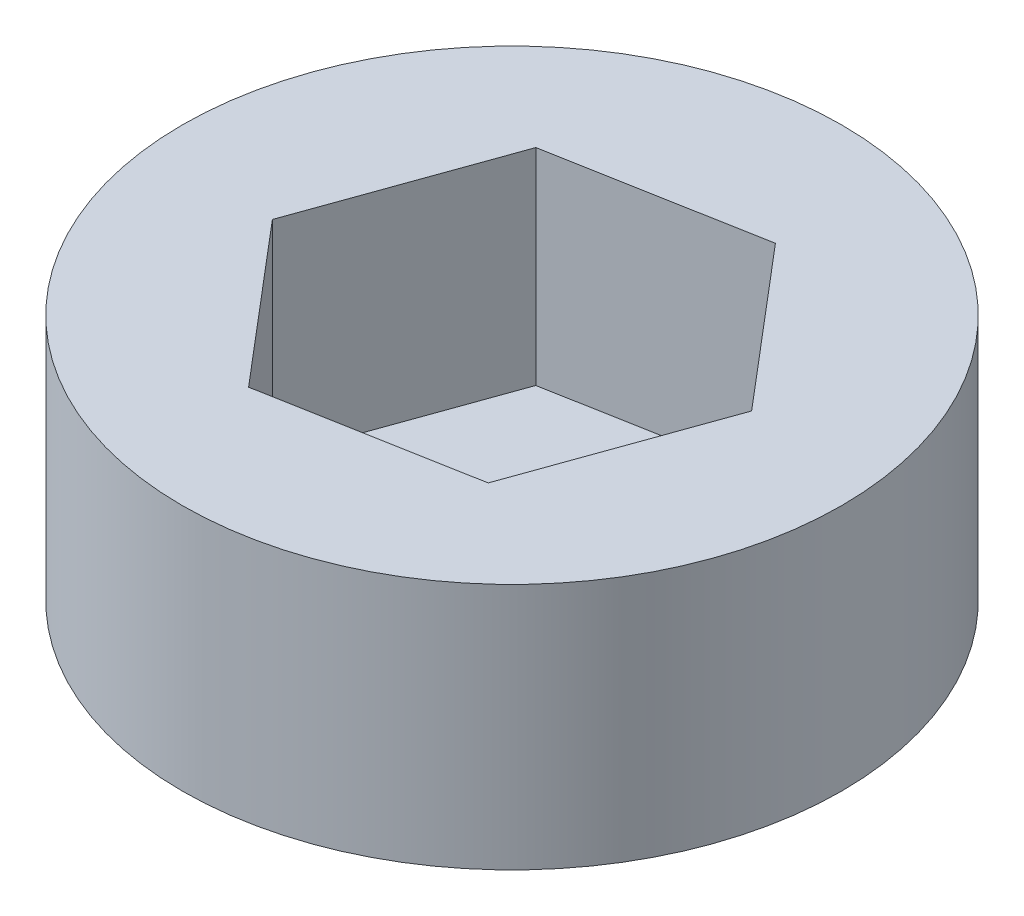
ISO-10303-21;
HEADER;
FILE_DESCRIPTION(('STEP AP214'),'2;1');
FILE_NAME('part.step','',(''),(''),'','','');
FILE_SCHEMA(('AUTOMOTIVE_DESIGN { 1 0 10303 214 1 1 1 1 }'));
ENDSEC;
DATA;
#1=APPLICATION_CONTEXT('core data for automotive mechanical design processes');
#2=APPLICATION_PROTOCOL_DEFINITION('international standard','automotive_design',2000,#1);
#3=PRODUCT_CONTEXT('',#1,'mechanical');
#4=PRODUCT('Part','Part','',(#3));
#5=PRODUCT_RELATED_PRODUCT_CATEGORY('part','',(#4));
#6=PRODUCT_DEFINITION_FORMATION('','',#4);
#7=PRODUCT_DEFINITION_CONTEXT('part definition',#1,'design');
#8=PRODUCT_DEFINITION('design','',#6,#7);
#9=PRODUCT_DEFINITION_SHAPE('','',#8);
#10=(LENGTH_UNIT() NAMED_UNIT(*) SI_UNIT(.MILLI.,.METRE.));
#11=(NAMED_UNIT(*) PLANE_ANGLE_UNIT() SI_UNIT($,.RADIAN.));
#12=(NAMED_UNIT(*) SI_UNIT($,.STERADIAN.) SOLID_ANGLE_UNIT());
#13=UNCERTAINTY_MEASURE_WITH_UNIT(LENGTH_MEASURE(1.E-05),#10,'distance_accuracy_value','');
#14=(GEOMETRIC_REPRESENTATION_CONTEXT(3) GLOBAL_UNCERTAINTY_ASSIGNED_CONTEXT((#13)) GLOBAL_UNIT_ASSIGNED_CONTEXT((#10,
#11,#12)) REPRESENTATION_CONTEXT('',''));
#15=CARTESIAN_POINT('',(0.,0.,0.));
#16=DIRECTION('',(0.,0.,1.));
#17=DIRECTION('',(1.,0.,0.));
#18=AXIS2_PLACEMENT_3D('',#15,#16,#17);
#19=CARTESIAN_POINT('',(0.,0.,0.));
#20=DIRECTION('',(0.,1.,0.));
#21=DIRECTION('',(0.,0.,1.));
#22=AXIS2_PLACEMENT_3D('',#19,#20,#21);
#23=CYLINDRICAL_SURFACE('',#22,1.5875);
#24=CARTESIAN_POINT('',(0.,0.,0.));
#25=DIRECTION('',(0.,1.,0.));
#26=DIRECTION('',(0.,0.,1.));
#27=AXIS2_PLACEMENT_3D('',#24,#25,#26);
#28=CIRCLE('',#27,1.5875);
#29=CARTESIAN_POINT('',(0.,0.,1.5875));
#30=VERTEX_POINT('',#29);
#31=EDGE_CURVE('E145',#30,#30,#28,.T.);
#32=CARTESIAN_POINT('',(0.,1.27,0.));
#33=DIRECTION('',(0.,1.,0.));
#34=DIRECTION('',(0.,0.,1.));
#35=AXIS2_PLACEMENT_3D('',#32,#33,#34);
#36=CIRCLE('',#35,1.5875);
#37=CARTESIAN_POINT('',(0.,1.27,1.5875));
#38=VERTEX_POINT('',#37);
#39=EDGE_CURVE('E39',#38,#38,#36,.F.);
#40=CARTESIAN_POINT('',(0.,0.,1.5875));
#41=CARTESIAN_POINT('',(0.,0.0132291666666667,1.5875));
#42=CARTESIAN_POINT('',(0.,0.0264583333333333,1.5875));
#43=CARTESIAN_POINT('',(0.,0.0529166666666666,1.5875));
#44=CARTESIAN_POINT('',(0.,0.0661458333333333,1.5875));
#45=CARTESIAN_POINT('',(0.,0.0926041666666666,1.5875));
#46=CARTESIAN_POINT('',(0.,0.105833333333333,1.5875));
#47=CARTESIAN_POINT('',(0.,0.132291666666667,1.5875));
#48=CARTESIAN_POINT('',(0.,0.145520833333333,1.5875));
#49=CARTESIAN_POINT('',(0.,0.171979166666667,1.5875));
#50=CARTESIAN_POINT('',(0.,0.185208333333333,1.5875));
#51=CARTESIAN_POINT('',(0.,0.211666666666667,1.5875));
#52=CARTESIAN_POINT('',(0.,0.224895833333333,1.5875));
#53=CARTESIAN_POINT('',(0.,0.251354166666666,1.5875));
#54=CARTESIAN_POINT('',(0.,0.264583333333333,1.5875));
#55=CARTESIAN_POINT('',(0.,0.291041666666666,1.5875));
#56=CARTESIAN_POINT('',(0.,0.304270833333333,1.5875));
#57=CARTESIAN_POINT('',(0.,0.330729166666666,1.5875));
#58=CARTESIAN_POINT('',(0.,0.343958333333333,1.5875));
#59=CARTESIAN_POINT('',(0.,0.370416666666666,1.5875));
#60=CARTESIAN_POINT('',(0.,0.383645833333333,1.5875));
#61=CARTESIAN_POINT('',(0.,0.410104166666666,1.5875));
#62=CARTESIAN_POINT('',(0.,0.423333333333333,1.5875));
#63=CARTESIAN_POINT('',(0.,0.449791666666666,1.5875));
#64=CARTESIAN_POINT('',(0.,0.463020833333333,1.5875));
#65=CARTESIAN_POINT('',(0.,0.489479166666666,1.5875));
#66=CARTESIAN_POINT('',(0.,0.502708333333333,1.5875));
#67=CARTESIAN_POINT('',(0.,0.529166666666666,1.5875));
#68=CARTESIAN_POINT('',(0.,0.542395833333333,1.5875));
#69=CARTESIAN_POINT('',(0.,0.568854166666666,1.5875));
#70=CARTESIAN_POINT('',(0.,0.582083333333333,1.5875));
#71=CARTESIAN_POINT('',(0.,0.608541666666666,1.5875));
#72=CARTESIAN_POINT('',(0.,0.621770833333333,1.5875));
#73=CARTESIAN_POINT('',(0.,0.648229166666666,1.5875));
#74=CARTESIAN_POINT('',(0.,0.661458333333333,1.5875));
#75=CARTESIAN_POINT('',(0.,0.687916666666666,1.5875));
#76=CARTESIAN_POINT('',(0.,0.701145833333333,1.5875));
#77=CARTESIAN_POINT('',(0.,0.727604166666666,1.5875));
#78=CARTESIAN_POINT('',(0.,0.740833333333333,1.5875));
#79=CARTESIAN_POINT('',(0.,0.767291666666666,1.5875));
#80=CARTESIAN_POINT('',(0.,0.780520833333333,1.5875));
#81=CARTESIAN_POINT('',(0.,0.806979166666666,1.5875));
#82=CARTESIAN_POINT('',(0.,0.820208333333333,1.5875));
#83=CARTESIAN_POINT('',(0.,0.846666666666666,1.5875));
#84=CARTESIAN_POINT('',(0.,0.859895833333333,1.5875));
#85=CARTESIAN_POINT('',(0.,0.886354166666666,1.5875));
#86=CARTESIAN_POINT('',(0.,0.899583333333333,1.5875));
#87=CARTESIAN_POINT('',(0.,0.926041666666666,1.5875));
#88=CARTESIAN_POINT('',(0.,0.939270833333333,1.5875));
#89=CARTESIAN_POINT('',(0.,0.965729166666666,1.5875));
#90=CARTESIAN_POINT('',(0.,0.978958333333333,1.5875));
#91=CARTESIAN_POINT('',(0.,1.00541666666667,1.5875));
#92=CARTESIAN_POINT('',(0.,1.01864583333333,1.5875));
#93=CARTESIAN_POINT('',(0.,1.04510416666667,1.5875));
#94=CARTESIAN_POINT('',(0.,1.05833333333333,1.5875));
#95=CARTESIAN_POINT('',(0.,1.08479166666667,1.5875));
#96=CARTESIAN_POINT('',(0.,1.09802083333333,1.5875));
#97=CARTESIAN_POINT('',(0.,1.12447916666667,1.5875));
#98=CARTESIAN_POINT('',(0.,1.13770833333333,1.5875));
#99=CARTESIAN_POINT('',(0.,1.16416666666667,1.5875));
#100=CARTESIAN_POINT('',(0.,1.17739583333333,1.5875));
#101=CARTESIAN_POINT('',(0.,1.20385416666667,1.5875));
#102=CARTESIAN_POINT('',(0.,1.21708333333333,1.5875));
#103=CARTESIAN_POINT('',(0.,1.24354166666667,1.5875));
#104=CARTESIAN_POINT('',(0.,1.25677083333333,1.5875));
#105=CARTESIAN_POINT('',(0.,1.27,1.5875));
#106=B_SPLINE_CURVE_WITH_KNOTS('',3,(#40,#41,#42,#43,#44,#45,#46,#47,#48,#49,#50,#51,#52,#53,
#54,#55,#56,#57,#58,#59,#60,#61,#62,#63,#64,#65,#66,#67,#68,#69,#70,#71,#72,#73,#74,#75,#76,#77,
#78,#79,#80,#81,#82,#83,#84,#85,#86,#87,#88,#89,#90,#91,#92,#93,#94,#95,#96,#97,#98,#99,#100,
#101,#102,#103,#104,#105),.UNSPECIFIED.,.F.,.F.,(4,2,2,2,2,2,2,2,2,2,2,2,2,2,2,2,2,2,2,2,2,2,2,
2,2,2,2,2,2,2,2,2,4),(0.,0.0396875,0.0793749999999999,0.1190625,0.15875,0.1984375,0.238125,
0.2778125,0.3175,0.3571875,0.396875,0.4365625,0.47625,0.5159375,0.555625,0.5953125,0.635,
0.6746875,0.714375,0.7540625,0.79375,0.833437499999999,0.873124999999999,0.912812499999999,
0.952499999999999,0.992187499999999,1.031875,1.0715625,1.11125,1.1509375,1.190625,1.2303125,
1.27),.UNSPECIFIED.);
#107=EDGE_CURVE('BSEAM35',#30,#38,#106,.T.);
#108=ORIENTED_EDGE('',*,*,#31,.F.);
#109=ORIENTED_EDGE('',*,*,#39,.F.);
#110=ORIENTED_EDGE('',*,*,#107,.T.);
#111=ORIENTED_EDGE('',*,*,#107,.F.);
#112=EDGE_LOOP('',(#108,#110,#109,#111));
#113=FACE_BOUND('',#112,.T.);
#114=ADVANCED_FACE('F35',(#113),#23,.F.);
#115=CARTESIAN_POINT('',(0.,7.62,0.));
#116=DIRECTION('',(0.,-1.,0.));
#117=DIRECTION('',(0.,0.,-1.));
#118=AXIS2_PLACEMENT_3D('',#115,#116,#117);
#119=CYLINDRICAL_SURFACE('',#118,10.16);
#120=CARTESIAN_POINT('',(0.,7.62,0.));
#121=DIRECTION('',(0.,1.,0.));
#122=DIRECTION('',(0.,0.,1.));
#123=AXIS2_PLACEMENT_3D('',#120,#121,#122);
#124=CIRCLE('',#123,10.16);
#125=CARTESIAN_POINT('',(0.,7.62,-10.16));
#126=VERTEX_POINT('',#125);
#127=EDGE_CURVE('E11',#126,#126,#124,.T.);
#128=CARTESIAN_POINT('',(0.,0.,0.));
#129=DIRECTION('',(0.,1.,0.));
#130=DIRECTION('',(0.,0.,1.));
#131=AXIS2_PLACEMENT_3D('',#128,#129,#130);
#132=CIRCLE('',#131,10.16);
#133=CARTESIAN_POINT('',(0.,0.,-10.16));
#134=VERTEX_POINT('',#133);
#135=EDGE_CURVE('E44',#134,#134,#132,.T.);
#136=CARTESIAN_POINT('',(0.,7.62,-10.16));
#137=CARTESIAN_POINT('',(0.,7.540625,-10.16));
#138=CARTESIAN_POINT('',(0.,7.46125,-10.16));
#139=CARTESIAN_POINT('',(0.,7.3025,-10.16));
#140=CARTESIAN_POINT('',(0.,7.223125,-10.16));
#141=CARTESIAN_POINT('',(0.,7.064375,-10.16));
#142=CARTESIAN_POINT('',(0.,6.985,-10.16));
#143=CARTESIAN_POINT('',(0.,6.82625,-10.16));
#144=CARTESIAN_POINT('',(0.,6.746875,-10.16));
#145=CARTESIAN_POINT('',(0.,6.588125,-10.16));
#146=CARTESIAN_POINT('',(0.,6.50875,-10.16));
#147=CARTESIAN_POINT('',(0.,6.35,-10.16));
#148=CARTESIAN_POINT('',(0.,6.270625,-10.16));
#149=CARTESIAN_POINT('',(0.,6.111875,-10.16));
#150=CARTESIAN_POINT('',(0.,6.0325,-10.16));
#151=CARTESIAN_POINT('',(0.,5.87375,-10.16));
#152=CARTESIAN_POINT('',(0.,5.794375,-10.16));
#153=CARTESIAN_POINT('',(0.,5.635625,-10.16));
#154=CARTESIAN_POINT('',(0.,5.55625,-10.16));
#155=CARTESIAN_POINT('',(0.,5.3975,-10.16));
#156=CARTESIAN_POINT('',(0.,5.318125,-10.16));
#157=CARTESIAN_POINT('',(0.,5.159375,-10.16));
#158=CARTESIAN_POINT('',(0.,5.08,-10.16));
#159=CARTESIAN_POINT('',(0.,4.92125,-10.16));
#160=CARTESIAN_POINT('',(0.,4.841875,-10.16));
#161=CARTESIAN_POINT('',(0.,4.683125,-10.16));
#162=CARTESIAN_POINT('',(0.,4.60375,-10.16));
#163=CARTESIAN_POINT('',(0.,4.445,-10.16));
#164=CARTESIAN_POINT('',(0.,4.365625,-10.16));
#165=CARTESIAN_POINT('',(0.,4.206875,-10.16));
#166=CARTESIAN_POINT('',(0.,4.1275,-10.16));
#167=CARTESIAN_POINT('',(0.,3.96875,-10.16));
#168=CARTESIAN_POINT('',(0.,3.889375,-10.16));
#169=CARTESIAN_POINT('',(0.,3.730625,-10.16));
#170=CARTESIAN_POINT('',(0.,3.65125,-10.16));
#171=CARTESIAN_POINT('',(0.,3.4925,-10.16));
#172=CARTESIAN_POINT('',(0.,3.413125,-10.16));
#173=CARTESIAN_POINT('',(0.,3.254375,-10.16));
#174=CARTESIAN_POINT('',(0.,3.175,-10.16));
#175=CARTESIAN_POINT('',(0.,3.01625,-10.16));
#176=CARTESIAN_POINT('',(0.,2.936875,-10.16));
#177=CARTESIAN_POINT('',(0.,2.778125,-10.16));
#178=CARTESIAN_POINT('',(0.,2.69875,-10.16));
#179=CARTESIAN_POINT('',(0.,2.54,-10.16));
#180=CARTESIAN_POINT('',(0.,2.460625,-10.16));
#181=CARTESIAN_POINT('',(0.,2.301875,-10.16));
#182=CARTESIAN_POINT('',(0.,2.2225,-10.16));
#183=CARTESIAN_POINT('',(0.,2.06375,-10.16));
#184=CARTESIAN_POINT('',(0.,1.984375,-10.16));
#185=CARTESIAN_POINT('',(0.,1.825625,-10.16));
#186=CARTESIAN_POINT('',(0.,1.74625,-10.16));
#187=CARTESIAN_POINT('',(0.,1.5875,-10.16));
#188=CARTESIAN_POINT('',(0.,1.508125,-10.16));
#189=CARTESIAN_POINT('',(0.,1.349375,-10.16));
#190=CARTESIAN_POINT('',(0.,1.27,-10.16));
#191=CARTESIAN_POINT('',(0.,1.11125,-10.16));
#192=CARTESIAN_POINT('',(0.,1.031875,-10.16));
#193=CARTESIAN_POINT('',(0.,0.873125,-10.16));
#194=CARTESIAN_POINT('',(0.,0.79375,-10.16));
#195=CARTESIAN_POINT('',(0.,0.635,-10.16));
#196=CARTESIAN_POINT('',(0.,0.555625,-10.16));
#197=CARTESIAN_POINT('',(0.,0.396875,-10.16));
#198=CARTESIAN_POINT('',(0.,0.3175,-10.16));
#199=CARTESIAN_POINT('',(0.,0.15875,-10.16));
#200=CARTESIAN_POINT('',(0.,0.0793749999999999,-10.16));
#201=CARTESIAN_POINT('',(0.,0.,-10.16));
#202=B_SPLINE_CURVE_WITH_KNOTS('',3,(#136,#137,#138,#139,#140,#141,#142,#143,#144,#145,#146,
#147,#148,#149,#150,#151,#152,#153,#154,#155,#156,#157,#158,#159,#160,#161,#162,#163,#164,#165,
#166,#167,#168,#169,#170,#171,#172,#173,#174,#175,#176,#177,#178,#179,#180,#181,#182,#183,#184,
#185,#186,#187,#188,#189,#190,#191,#192,#193,#194,#195,#196,#197,#198,#199,#200,#201),
.UNSPECIFIED.,.F.,.F.,(4,2,2,2,2,2,2,2,2,2,2,2,2,2,2,2,2,2,2,2,2,2,2,2,2,2,2,2,2,2,2,2,4),(0.,
0.238125,0.47625,0.714375000000001,0.9525,1.190625,1.42875,1.666875,1.905,2.143125,2.38125,
2.619375,2.8575,3.095625,3.33375,3.571875,3.81,4.048125,4.28625,4.524375,4.7625,5.000625,
5.23875,5.476875,5.715,5.953125,6.19125,6.429375,6.6675,6.905625,7.14375,7.381875,7.62),.UNSPECIFIED.);
#203=EDGE_CURVE('BSEAM37',#126,#134,#202,.T.);
#204=ORIENTED_EDGE('',*,*,#127,.F.);
#205=ORIENTED_EDGE('',*,*,#135,.T.);
#206=ORIENTED_EDGE('',*,*,#203,.T.);
#207=ORIENTED_EDGE('',*,*,#203,.F.);
#208=EDGE_LOOP('',(#204,#206,#205,#207));
#209=FACE_BOUND('',#208,.T.);
#210=ADVANCED_FACE('F37',(#209),#119,.T.);
#211=CARTESIAN_POINT('',(0.,7.62,0.));
#212=DIRECTION('',(0.,1.,0.));
#213=DIRECTION('',(0.,0.,1.));
#214=AXIS2_PLACEMENT_3D('',#211,#212,#213);
#215=PLANE('',#214);
#216=DIRECTION('',(0.336838208201734,0.,-0.94156254252994));
#217=VECTOR('',#216,1.);
#218=CARTESIAN_POINT('',(4.10843715383524,7.62,4.84182239998394));
#219=LINE('',#218,#217);
#220=CARTESIAN_POINT('',(4.10843715383524,7.62,4.84182239998394));
#221=VERTEX_POINT('',#220);
#222=CARTESIAN_POINT('',(6.24735977591625,7.62,-1.13709974508118));
#223=VERTEX_POINT('',#222);
#224=EDGE_CURVE('E52',#221,#223,#219,.T.);
#225=ORIENTED_EDGE('',*,*,#224,.F.);
#226=DIRECTION('',(0.983836185183661,0.,-0.179070825997037));
#227=VECTOR('',#226,1.);
#228=CARTESIAN_POINT('',(-2.13892262208101,7.62,5.97892214506512));
#229=LINE('',#228,#227);
#230=CARTESIAN_POINT('',(-2.13892262208101,7.62,5.97892214506512));
#231=VERTEX_POINT('',#230);
#232=EDGE_CURVE('E136',#231,#221,#229,.T.);
#233=ORIENTED_EDGE('',*,*,#232,.F.);
#234=DIRECTION('',(0.646997976981927,0.,0.762491716532903));
#235=VECTOR('',#234,1.);
#236=CARTESIAN_POINT('',(-6.24735977591625,7.62,1.13709974508118));
#237=LINE('',#236,#235);
#238=CARTESIAN_POINT('',(-6.24735977591625,7.62,1.13709974508118));
#239=VERTEX_POINT('',#238);
#240=EDGE_CURVE('E134',#239,#231,#237,.T.);
#241=ORIENTED_EDGE('',*,*,#240,.F.);
#242=DIRECTION('',(-0.336838208201733,0.,0.94156254252994));
#243=VECTOR('',#242,1.);
#244=CARTESIAN_POINT('',(-4.10843715383524,7.62,-4.84182239998394));
#245=LINE('',#244,#243);
#246=CARTESIAN_POINT('',(-4.10843715383524,7.62,-4.84182239998394));
#247=VERTEX_POINT('',#246);
#248=EDGE_CURVE('E100',#247,#239,#245,.T.);
#249=ORIENTED_EDGE('',*,*,#248,.F.);
#250=DIRECTION('',(-0.983836185183661,0.,0.179070825997037));
#251=VECTOR('',#250,1.);
#252=CARTESIAN_POINT('',(2.13892262208101,7.62,-5.97892214506512));
#253=LINE('',#252,#251);
#254=CARTESIAN_POINT('',(2.13892262208101,7.62,-5.97892214506512));
#255=VERTEX_POINT('',#254);
#256=EDGE_CURVE('E130',#255,#247,#253,.T.);
#257=ORIENTED_EDGE('',*,*,#256,.F.);
#258=DIRECTION('',(-0.646997976981928,0.,-0.762491716532903));
#259=VECTOR('',#258,1.);
#260=CARTESIAN_POINT('',(6.24735977591625,7.62,-1.13709974508118));
#261=LINE('',#260,#259);
#262=EDGE_CURVE('E127',#223,#255,#261,.T.);
#263=ORIENTED_EDGE('',*,*,#262,.F.);
#264=EDGE_LOOP('',(#225,#233,#241,#249,#257,#263));
#265=FACE_BOUND('',#264,.T.);
#266=ORIENTED_EDGE('',*,*,#127,.T.);
#267=EDGE_LOOP('',(#266));
#268=FACE_BOUND('',#267,.T.);
#269=ADVANCED_FACE('F153',(#265,#268),#215,.T.);
#270=CARTESIAN_POINT('',(0.,0.,0.));
#271=DIRECTION('',(0.,1.,0.));
#272=DIRECTION('',(0.,0.,1.));
#273=AXIS2_PLACEMENT_3D('',#270,#271,#272);
#274=PLANE('',#273);
#275=ORIENTED_EDGE('',*,*,#31,.T.);
#276=EDGE_LOOP('',(#275));
#277=FACE_BOUND('',#276,.T.);
#278=ORIENTED_EDGE('',*,*,#135,.F.);
#279=EDGE_LOOP('',(#278));
#280=FACE_BOUND('',#279,.T.);
#281=ADVANCED_FACE('F151',(#277,#280),#274,.F.);
#282=CARTESIAN_POINT('',(0.,1.27,0.));
#283=DIRECTION('',(0.,1.,0.));
#284=DIRECTION('',(0.,0.,1.));
#285=AXIS2_PLACEMENT_3D('',#282,#283,#284);
#286=PLANE('',#285);
#287=DIRECTION('',(0.336838208201734,0.,-0.94156254252994));
#288=VECTOR('',#287,1.);
#289=CARTESIAN_POINT('',(4.10843715383524,1.27,4.84182239998394));
#290=LINE('',#289,#288);
#291=CARTESIAN_POINT('',(4.10843715383524,1.27,4.84182239998394));
#292=VERTEX_POINT('',#291);
#293=CARTESIAN_POINT('',(6.24735977591625,1.27,-1.13709974508118));
#294=VERTEX_POINT('',#293);
#295=EDGE_CURVE('E138',#292,#294,#290,.T.);
#296=ORIENTED_EDGE('',*,*,#295,.T.);
#297=DIRECTION('',(-0.646997976981928,0.,-0.762491716532903));
#298=VECTOR('',#297,1.);
#299=CARTESIAN_POINT('',(6.24735977591625,1.27,-1.13709974508118));
#300=LINE('',#299,#298);
#301=CARTESIAN_POINT('',(2.13892262208101,1.27,-5.97892214506512));
#302=VERTEX_POINT('',#301);
#303=EDGE_CURVE('E121',#294,#302,#300,.T.);
#304=ORIENTED_EDGE('',*,*,#303,.T.);
#305=DIRECTION('',(-0.983836185183661,0.,0.179070825997037));
#306=VECTOR('',#305,1.);
#307=CARTESIAN_POINT('',(2.13892262208101,1.27,-5.97892214506512));
#308=LINE('',#307,#306);
#309=CARTESIAN_POINT('',(-4.10843715383524,1.27,-4.84182239998394));
#310=VERTEX_POINT('',#309);
#311=EDGE_CURVE('E119',#302,#310,#308,.T.);
#312=ORIENTED_EDGE('',*,*,#311,.T.);
#313=DIRECTION('',(-0.336838208201733,0.,0.94156254252994));
#314=VECTOR('',#313,1.);
#315=CARTESIAN_POINT('',(-4.10843715383524,1.27,-4.84182239998394));
#316=LINE('',#315,#314);
#317=CARTESIAN_POINT('',(-6.24735977591625,1.27,1.13709974508118));
#318=VERTEX_POINT('',#317);
#319=EDGE_CURVE('E97',#310,#318,#316,.T.);
#320=ORIENTED_EDGE('',*,*,#319,.T.);
#321=DIRECTION('',(0.646997976981927,0.,0.762491716532903));
#322=VECTOR('',#321,1.);
#323=CARTESIAN_POINT('',(-6.24735977591625,1.27,1.13709974508118));
#324=LINE('',#323,#322);
#325=CARTESIAN_POINT('',(-2.13892262208101,1.27,5.97892214506512));
#326=VERTEX_POINT('',#325);
#327=EDGE_CURVE('E108',#318,#326,#324,.T.);
#328=ORIENTED_EDGE('',*,*,#327,.T.);
#329=DIRECTION('',(0.983836185183661,0.,-0.179070825997037));
#330=VECTOR('',#329,1.);
#331=CARTESIAN_POINT('',(-2.13892262208101,1.27,5.97892214506512));
#332=LINE('',#331,#330);
#333=EDGE_CURVE('E112',#326,#292,#332,.T.);
#334=ORIENTED_EDGE('',*,*,#333,.T.);
#335=EDGE_LOOP('',(#296,#304,#312,#320,#328,#334));
#336=FACE_BOUND('',#335,.T.);
#337=ORIENTED_EDGE('',*,*,#39,.T.);
#338=EDGE_LOOP('',(#337));
#339=FACE_BOUND('',#338,.T.);
#340=ADVANCED_FACE('F115',(#336,#339),#286,.T.);
#341=CARTESIAN_POINT('',(4.10843715383524,1.27,4.84182239998394));
#342=DIRECTION('',(0.94156254252994,0.,0.336838208201734));
#343=DIRECTION('',(0.336838208201734,0.,-0.94156254252994));
#344=AXIS2_PLACEMENT_3D('',#341,#342,#343);
#345=PLANE('',#344);
#346=ORIENTED_EDGE('',*,*,#224,.T.);
#347=DIRECTION('',(0.,1.,0.));
#348=VECTOR('',#347,1.);
#349=CARTESIAN_POINT('',(6.24735977591625,1.27,-1.13709974508118));
#350=LINE('',#349,#348);
#351=EDGE_CURVE('E82',#294,#223,#350,.T.);
#352=ORIENTED_EDGE('',*,*,#351,.F.);
#353=ORIENTED_EDGE('',*,*,#295,.F.);
#354=DIRECTION('',(0.,1.,0.));
#355=VECTOR('',#354,1.);
#356=CARTESIAN_POINT('',(4.10843715383524,1.27,4.84182239998394));
#357=LINE('',#356,#355);
#358=EDGE_CURVE('E60',#292,#221,#357,.T.);
#359=ORIENTED_EDGE('',*,*,#358,.T.);
#360=EDGE_LOOP('',(#346,#352,#353,#359));
#361=FACE_BOUND('',#360,.T.);
#362=ADVANCED_FACE('F159',(#361),#345,.F.);
#363=CARTESIAN_POINT('',(-2.13892262208101,1.27,5.97892214506512));
#364=DIRECTION('',(0.179070825997037,0.,0.983836185183661));
#365=DIRECTION('',(0.983836185183661,0.,-0.179070825997037));
#366=AXIS2_PLACEMENT_3D('',#363,#364,#365);
#367=PLANE('',#366);
#368=ORIENTED_EDGE('',*,*,#232,.T.);
#369=ORIENTED_EDGE('',*,*,#358,.F.);
#370=ORIENTED_EDGE('',*,*,#333,.F.);
#371=DIRECTION('',(0.,1.,0.));
#372=VECTOR('',#371,1.);
#373=CARTESIAN_POINT('',(-2.13892262208101,1.27,5.97892214506512));
#374=LINE('',#373,#372);
#375=EDGE_CURVE('E104',#326,#231,#374,.T.);
#376=ORIENTED_EDGE('',*,*,#375,.T.);
#377=EDGE_LOOP('',(#368,#369,#370,#376));
#378=FACE_BOUND('',#377,.T.);
#379=ADVANCED_FACE('F175',(#378),#367,.F.);
#380=CARTESIAN_POINT('',(-6.24735977591625,1.27,1.13709974508118));
#381=DIRECTION('',(-0.762491716532903,0.,0.646997976981927));
#382=DIRECTION('',(0.646997976981927,0.,0.762491716532904));
#383=AXIS2_PLACEMENT_3D('',#380,#381,#382);
#384=PLANE('',#383);
#385=ORIENTED_EDGE('',*,*,#240,.T.);
#386=ORIENTED_EDGE('',*,*,#375,.F.);
#387=ORIENTED_EDGE('',*,*,#327,.F.);
#388=DIRECTION('',(0.,1.,0.));
#389=VECTOR('',#388,1.);
#390=CARTESIAN_POINT('',(-6.24735977591625,1.27,1.13709974508118));
#391=LINE('',#390,#389);
#392=EDGE_CURVE('E93',#318,#239,#391,.T.);
#393=ORIENTED_EDGE('',*,*,#392,.T.);
#394=EDGE_LOOP('',(#385,#386,#387,#393));
#395=FACE_BOUND('',#394,.T.);
#396=ADVANCED_FACE('F109',(#395),#384,.F.);
#397=CARTESIAN_POINT('',(-4.10843715383524,1.27,-4.84182239998394));
#398=DIRECTION('',(-0.94156254252994,0.,-0.336838208201733));
#399=DIRECTION('',(-0.336838208201733,0.,0.941562542529941));
#400=AXIS2_PLACEMENT_3D('',#397,#398,#399);
#401=PLANE('',#400);
#402=ORIENTED_EDGE('',*,*,#248,.T.);
#403=ORIENTED_EDGE('',*,*,#392,.F.);
#404=ORIENTED_EDGE('',*,*,#319,.F.);
#405=DIRECTION('',(0.,1.,0.));
#406=VECTOR('',#405,1.);
#407=CARTESIAN_POINT('',(-4.10843715383524,1.27,-4.84182239998394));
#408=LINE('',#407,#406);
#409=EDGE_CURVE('E105',#310,#247,#408,.T.);
#410=ORIENTED_EDGE('',*,*,#409,.T.);
#411=EDGE_LOOP('',(#402,#403,#404,#410));
#412=FACE_BOUND('',#411,.T.);
#413=ADVANCED_FACE('F95',(#412),#401,.F.);
#414=CARTESIAN_POINT('',(2.13892262208101,1.27,-5.97892214506512));
#415=DIRECTION('',(-0.179070825997037,0.,-0.983836185183661));
#416=DIRECTION('',(-0.983836185183661,0.,0.179070825997037));
#417=AXIS2_PLACEMENT_3D('',#414,#415,#416);
#418=PLANE('',#417);
#419=ORIENTED_EDGE('',*,*,#256,.T.);
#420=ORIENTED_EDGE('',*,*,#409,.F.);
#421=ORIENTED_EDGE('',*,*,#311,.F.);
#422=DIRECTION('',(0.,1.,0.));
#423=VECTOR('',#422,1.);
#424=CARTESIAN_POINT('',(2.13892262208101,1.27,-5.97892214506512));
#425=LINE('',#424,#423);
#426=EDGE_CURVE('E142',#302,#255,#425,.T.);
#427=ORIENTED_EDGE('',*,*,#426,.T.);
#428=EDGE_LOOP('',(#419,#420,#421,#427));
#429=FACE_BOUND('',#428,.T.);
#430=ADVANCED_FACE('F179',(#429),#418,.F.);
#431=CARTESIAN_POINT('',(6.24735977591625,1.27,-1.13709974508118));
#432=DIRECTION('',(0.762491716532903,0.,-0.646997976981927));
#433=DIRECTION('',(-0.646997976981927,0.,-0.762491716532903));
#434=AXIS2_PLACEMENT_3D('',#431,#432,#433);
#435=PLANE('',#434);
#436=ORIENTED_EDGE('',*,*,#262,.T.);
#437=ORIENTED_EDGE('',*,*,#426,.F.);
#438=ORIENTED_EDGE('',*,*,#303,.F.);
#439=ORIENTED_EDGE('',*,*,#351,.T.);
#440=EDGE_LOOP('',(#436,#437,#438,#439));
#441=FACE_BOUND('',#440,.T.);
#442=ADVANCED_FACE('F176',(#441),#435,.F.);
#443=CLOSED_SHELL('',(#114,#210,#269,#281,#340,#362,#379,#396,#413,#430,#442));
#444=MANIFOLD_SOLID_BREP('B2',#443);
#445=ADVANCED_BREP_SHAPE_REPRESENTATION('',(#18,#444),#14);
#446=SHAPE_DEFINITION_REPRESENTATION(#9,#445);
ENDSEC;
END-ISO-10303-21;
